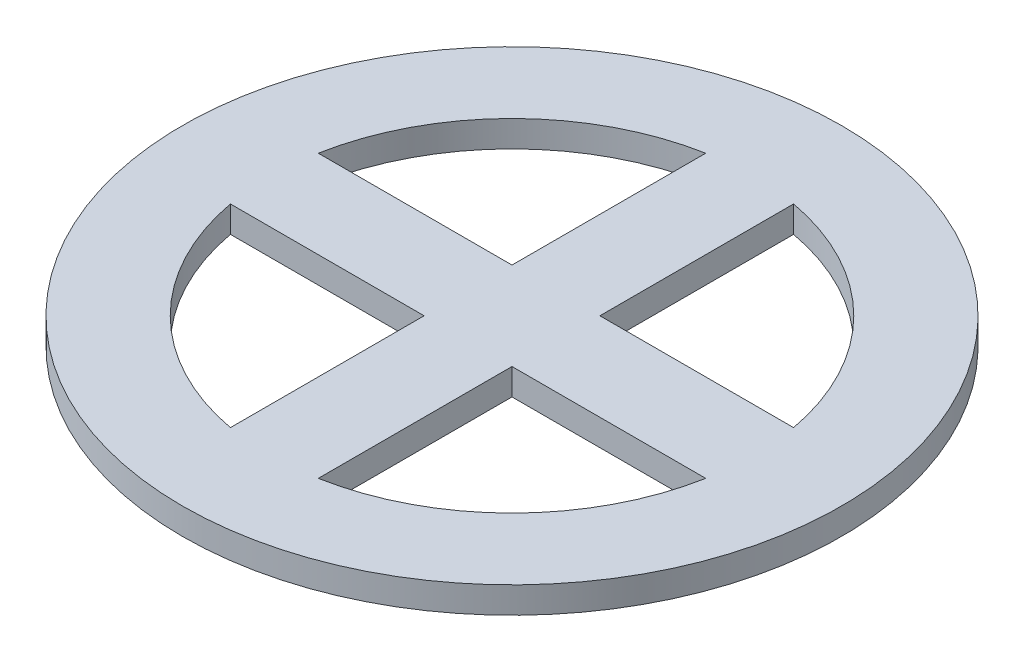
ISO-10303-21;
HEADER;
FILE_DESCRIPTION(('STEP AP214'),'2;1');
FILE_NAME('part.step','',(''),(''),'','','');
FILE_SCHEMA(('AUTOMOTIVE_DESIGN { 1 0 10303 214 1 1 1 1 }'));
ENDSEC;
DATA;
#1=APPLICATION_CONTEXT('core data for automotive mechanical design processes');
#2=APPLICATION_PROTOCOL_DEFINITION('international standard','automotive_design',2000,#1);
#3=PRODUCT_CONTEXT('',#1,'mechanical');
#4=PRODUCT('Part','Part','',(#3));
#5=PRODUCT_RELATED_PRODUCT_CATEGORY('part','',(#4));
#6=PRODUCT_DEFINITION_FORMATION('','',#4);
#7=PRODUCT_DEFINITION_CONTEXT('part definition',#1,'design');
#8=PRODUCT_DEFINITION('design','',#6,#7);
#9=PRODUCT_DEFINITION_SHAPE('','',#8);
#10=(LENGTH_UNIT() NAMED_UNIT(*) SI_UNIT(.MILLI.,.METRE.));
#11=(NAMED_UNIT(*) PLANE_ANGLE_UNIT() SI_UNIT($,.RADIAN.));
#12=(NAMED_UNIT(*) SI_UNIT($,.STERADIAN.) SOLID_ANGLE_UNIT());
#13=UNCERTAINTY_MEASURE_WITH_UNIT(LENGTH_MEASURE(1.E-05),#10,'distance_accuracy_value','');
#14=(GEOMETRIC_REPRESENTATION_CONTEXT(3) GLOBAL_UNCERTAINTY_ASSIGNED_CONTEXT((#13)) GLOBAL_UNIT_ASSIGNED_CONTEXT((#10,
#11,#12)) REPRESENTATION_CONTEXT('',''));
#15=CARTESIAN_POINT('',(0.,0.,0.));
#16=DIRECTION('',(0.,0.,1.));
#17=DIRECTION('',(1.,0.,0.));
#18=AXIS2_PLACEMENT_3D('',#15,#16,#17);
#19=CARTESIAN_POINT('',(-10.,6.,0.));
#20=DIRECTION('',(1.,0.,0.));
#21=DIRECTION('',(0.,0.,-1.));
#22=AXIS2_PLACEMENT_3D('',#19,#20,#21);
#23=PLANE('',#22);
#24=DIRECTION('',(0.,0.,1.));
#25=VECTOR('',#24,1.);
#26=CARTESIAN_POINT('',(-10.,0.,0.));
#27=LINE('',#26,#25);
#28=CARTESIAN_POINT('',(-10.,0.,-54.0832691319599));
#29=VERTEX_POINT('',#28);
#30=CARTESIAN_POINT('',(-10.,0.,-10.));
#31=VERTEX_POINT('',#30);
#32=EDGE_CURVE('E138',#29,#31,#27,.T.);
#33=ORIENTED_EDGE('',*,*,#32,.T.);
#34=DIRECTION('',(0.,-1.,0.));
#35=VECTOR('',#34,1.);
#36=CARTESIAN_POINT('',(-10.,6.,-10.));
#37=LINE('',#36,#35);
#38=CARTESIAN_POINT('',(-10.,6.,-10.));
#39=VERTEX_POINT('',#38);
#40=EDGE_CURVE('E11',#39,#31,#37,.T.);
#41=ORIENTED_EDGE('',*,*,#40,.F.);
#42=DIRECTION('',(0.,0.,1.));
#43=VECTOR('',#42,1.);
#44=CARTESIAN_POINT('',(-10.,6.,0.));
#45=LINE('',#44,#43);
#46=CARTESIAN_POINT('',(-10.,6.,-54.0832691319599));
#47=VERTEX_POINT('',#46);
#48=EDGE_CURVE('E129',#47,#39,#45,.T.);
#49=ORIENTED_EDGE('',*,*,#48,.F.);
#50=DIRECTION('',(0.,-1.,0.));
#51=VECTOR('',#50,1.);
#52=CARTESIAN_POINT('',(-10.,6.,-54.0832691319599));
#53=LINE('',#52,#51);
#54=EDGE_CURVE('E52',#47,#29,#53,.T.);
#55=ORIENTED_EDGE('',*,*,#54,.T.);
#56=EDGE_LOOP('',(#33,#41,#49,#55));
#57=FACE_BOUND('',#56,.T.);
#58=ADVANCED_FACE('F33',(#57),#23,.F.);
#59=CARTESIAN_POINT('',(0.,6.,-10.));
#60=DIRECTION('',(0.,0.,-1.));
#61=DIRECTION('',(-1.,0.,0.));
#62=AXIS2_PLACEMENT_3D('',#59,#60,#61);
#63=PLANE('',#62);
#64=DIRECTION('',(1.,0.,0.));
#65=VECTOR('',#64,1.);
#66=CARTESIAN_POINT('',(0.,0.,-10.));
#67=LINE('',#66,#65);
#68=CARTESIAN_POINT('',(-54.0832691319599,0.,-10.));
#69=VERTEX_POINT('',#68);
#70=EDGE_CURVE('E176',#69,#31,#67,.T.);
#71=ORIENTED_EDGE('',*,*,#70,.F.);
#72=DIRECTION('',(0.,-1.,0.));
#73=VECTOR('',#72,1.);
#74=CARTESIAN_POINT('',(-54.0832691319599,6.,-10.));
#75=LINE('',#74,#73);
#76=CARTESIAN_POINT('',(-54.0832691319599,6.,-10.));
#77=VERTEX_POINT('',#76);
#78=EDGE_CURVE('E43',#77,#69,#75,.T.);
#79=ORIENTED_EDGE('',*,*,#78,.F.);
#80=DIRECTION('',(1.,0.,0.));
#81=VECTOR('',#80,1.);
#82=CARTESIAN_POINT('',(0.,6.,-10.));
#83=LINE('',#82,#81);
#84=EDGE_CURVE('E134',#77,#39,#83,.T.);
#85=ORIENTED_EDGE('',*,*,#84,.T.);
#86=ORIENTED_EDGE('',*,*,#40,.T.);
#87=EDGE_LOOP('',(#71,#79,#85,#86));
#88=FACE_BOUND('',#87,.T.);
#89=ADVANCED_FACE('F141',(#88),#63,.T.);
#90=CARTESIAN_POINT('',(10.,6.,0.));
#91=DIRECTION('',(1.,0.,0.));
#92=DIRECTION('',(0.,0.,-1.));
#93=AXIS2_PLACEMENT_3D('',#90,#91,#92);
#94=PLANE('',#93);
#95=DIRECTION('',(0.,0.,1.));
#96=VECTOR('',#95,1.);
#97=CARTESIAN_POINT('',(10.,0.,0.));
#98=LINE('',#97,#96);
#99=CARTESIAN_POINT('',(10.,0.,10.));
#100=VERTEX_POINT('',#99);
#101=CARTESIAN_POINT('',(10.,0.,54.0832691319599));
#102=VERTEX_POINT('',#101);
#103=EDGE_CURVE('E168',#100,#102,#98,.T.);
#104=ORIENTED_EDGE('',*,*,#103,.F.);
#105=DIRECTION('',(0.,-1.,0.));
#106=VECTOR('',#105,1.);
#107=CARTESIAN_POINT('',(10.,6.,10.));
#108=LINE('',#107,#106);
#109=CARTESIAN_POINT('',(10.,6.,10.));
#110=VERTEX_POINT('',#109);
#111=EDGE_CURVE('E183',#110,#100,#108,.T.);
#112=ORIENTED_EDGE('',*,*,#111,.F.);
#113=DIRECTION('',(0.,0.,1.));
#114=VECTOR('',#113,1.);
#115=CARTESIAN_POINT('',(10.,6.,0.));
#116=LINE('',#115,#114);
#117=CARTESIAN_POINT('',(10.,6.,54.0832691319599));
#118=VERTEX_POINT('',#117);
#119=EDGE_CURVE('E220',#110,#118,#116,.T.);
#120=ORIENTED_EDGE('',*,*,#119,.T.);
#121=DIRECTION('',(0.,-1.,0.));
#122=VECTOR('',#121,1.);
#123=CARTESIAN_POINT('',(10.,6.,54.0832691319599));
#124=LINE('',#123,#122);
#125=EDGE_CURVE('E185',#118,#102,#124,.T.);
#126=ORIENTED_EDGE('',*,*,#125,.T.);
#127=EDGE_LOOP('',(#104,#112,#120,#126));
#128=FACE_BOUND('',#127,.T.);
#129=ADVANCED_FACE('F263',(#128),#94,.T.);
#130=CARTESIAN_POINT('',(0.,6.,10.));
#131=DIRECTION('',(0.,0.,-1.));
#132=DIRECTION('',(-1.,0.,0.));
#133=AXIS2_PLACEMENT_3D('',#130,#131,#132);
#134=PLANE('',#133);
#135=DIRECTION('',(1.,0.,0.));
#136=VECTOR('',#135,1.);
#137=CARTESIAN_POINT('',(0.,0.,10.));
#138=LINE('',#137,#136);
#139=CARTESIAN_POINT('',(54.0832691319599,0.,10.));
#140=VERTEX_POINT('',#139);
#141=EDGE_CURVE('E171',#100,#140,#138,.T.);
#142=ORIENTED_EDGE('',*,*,#141,.T.);
#143=DIRECTION('',(0.,-1.,0.));
#144=VECTOR('',#143,1.);
#145=CARTESIAN_POINT('',(54.0832691319599,6.,10.));
#146=LINE('',#145,#144);
#147=CARTESIAN_POINT('',(54.0832691319599,6.,10.));
#148=VERTEX_POINT('',#147);
#149=EDGE_CURVE('E187',#148,#140,#146,.T.);
#150=ORIENTED_EDGE('',*,*,#149,.F.);
#151=DIRECTION('',(1.,0.,0.));
#152=VECTOR('',#151,1.);
#153=CARTESIAN_POINT('',(0.,6.,10.));
#154=LINE('',#153,#152);
#155=EDGE_CURVE('E224',#110,#148,#154,.T.);
#156=ORIENTED_EDGE('',*,*,#155,.F.);
#157=ORIENTED_EDGE('',*,*,#111,.T.);
#158=EDGE_LOOP('',(#142,#150,#156,#157));
#159=FACE_BOUND('',#158,.T.);
#160=ADVANCED_FACE('F236',(#159),#134,.F.);
#161=CARTESIAN_POINT('',(0.,6.,-10.));
#162=DIRECTION('',(0.,0.,-1.));
#163=DIRECTION('',(-1.,0.,0.));
#164=AXIS2_PLACEMENT_3D('',#161,#162,#163);
#165=PLANE('',#164);
#166=DIRECTION('',(1.,0.,0.));
#167=VECTOR('',#166,1.);
#168=CARTESIAN_POINT('',(0.,0.,-10.));
#169=LINE('',#168,#167);
#170=CARTESIAN_POINT('',(10.,0.,-10.));
#171=VERTEX_POINT('',#170);
#172=CARTESIAN_POINT('',(54.0832691319599,0.,-10.));
#173=VERTEX_POINT('',#172);
#174=EDGE_CURVE('E160',#171,#173,#169,.T.);
#175=ORIENTED_EDGE('',*,*,#174,.F.);
#176=DIRECTION('',(0.,-1.,0.));
#177=VECTOR('',#176,1.);
#178=CARTESIAN_POINT('',(10.,6.,-10.));
#179=LINE('',#178,#177);
#180=CARTESIAN_POINT('',(10.,6.,-10.));
#181=VERTEX_POINT('',#180);
#182=EDGE_CURVE('E188',#181,#171,#179,.T.);
#183=ORIENTED_EDGE('',*,*,#182,.F.);
#184=DIRECTION('',(1.,0.,0.));
#185=VECTOR('',#184,1.);
#186=CARTESIAN_POINT('',(0.,6.,-10.));
#187=LINE('',#186,#185);
#188=CARTESIAN_POINT('',(54.0832691319599,6.,-10.));
#189=VERTEX_POINT('',#188);
#190=EDGE_CURVE('E213',#181,#189,#187,.T.);
#191=ORIENTED_EDGE('',*,*,#190,.T.);
#192=DIRECTION('',(0.,-1.,0.));
#193=VECTOR('',#192,1.);
#194=CARTESIAN_POINT('',(54.0832691319599,6.,-10.));
#195=LINE('',#194,#193);
#196=EDGE_CURVE('E191',#189,#173,#195,.T.);
#197=ORIENTED_EDGE('',*,*,#196,.T.);
#198=EDGE_LOOP('',(#175,#183,#191,#197));
#199=FACE_BOUND('',#198,.T.);
#200=ADVANCED_FACE('F267',(#199),#165,.T.);
#201=CARTESIAN_POINT('',(10.,6.,0.));
#202=DIRECTION('',(1.,0.,0.));
#203=DIRECTION('',(0.,0.,-1.));
#204=AXIS2_PLACEMENT_3D('',#201,#202,#203);
#205=PLANE('',#204);
#206=DIRECTION('',(0.,0.,1.));
#207=VECTOR('',#206,1.);
#208=CARTESIAN_POINT('',(10.,0.,0.));
#209=LINE('',#208,#207);
#210=CARTESIAN_POINT('',(10.,0.,-54.0832691319599));
#211=VERTEX_POINT('',#210);
#212=EDGE_CURVE('E165',#211,#171,#209,.T.);
#213=ORIENTED_EDGE('',*,*,#212,.F.);
#214=DIRECTION('',(0.,-1.,0.));
#215=VECTOR('',#214,1.);
#216=CARTESIAN_POINT('',(10.,6.,-54.0832691319599));
#217=LINE('',#216,#215);
#218=CARTESIAN_POINT('',(10.,6.,-54.0832691319599));
#219=VERTEX_POINT('',#218);
#220=EDGE_CURVE('E193',#219,#211,#217,.T.);
#221=ORIENTED_EDGE('',*,*,#220,.F.);
#222=DIRECTION('',(0.,0.,1.));
#223=VECTOR('',#222,1.);
#224=CARTESIAN_POINT('',(10.,6.,0.));
#225=LINE('',#224,#223);
#226=EDGE_CURVE('E216',#219,#181,#225,.T.);
#227=ORIENTED_EDGE('',*,*,#226,.T.);
#228=ORIENTED_EDGE('',*,*,#182,.T.);
#229=EDGE_LOOP('',(#213,#221,#227,#228));
#230=FACE_BOUND('',#229,.T.);
#231=ADVANCED_FACE('F271',(#230),#205,.T.);
#232=CARTESIAN_POINT('',(0.,6.,10.));
#233=DIRECTION('',(0.,0.,-1.));
#234=DIRECTION('',(-1.,0.,0.));
#235=AXIS2_PLACEMENT_3D('',#232,#233,#234);
#236=PLANE('',#235);
#237=DIRECTION('',(1.,0.,0.));
#238=VECTOR('',#237,1.);
#239=CARTESIAN_POINT('',(0.,0.,10.));
#240=LINE('',#239,#238);
#241=CARTESIAN_POINT('',(-54.0832691319599,0.,10.));
#242=VERTEX_POINT('',#241);
#243=CARTESIAN_POINT('',(-10.,0.,10.));
#244=VERTEX_POINT('',#243);
#245=EDGE_CURVE('E151',#242,#244,#240,.T.);
#246=ORIENTED_EDGE('',*,*,#245,.T.);
#247=DIRECTION('',(0.,-1.,0.));
#248=VECTOR('',#247,1.);
#249=CARTESIAN_POINT('',(-10.,6.,10.));
#250=LINE('',#249,#248);
#251=CARTESIAN_POINT('',(-10.,6.,10.));
#252=VERTEX_POINT('',#251);
#253=EDGE_CURVE('E37',#252,#244,#250,.T.);
#254=ORIENTED_EDGE('',*,*,#253,.F.);
#255=DIRECTION('',(1.,0.,0.));
#256=VECTOR('',#255,1.);
#257=CARTESIAN_POINT('',(0.,6.,10.));
#258=LINE('',#257,#256);
#259=CARTESIAN_POINT('',(-54.0832691319599,6.,10.));
#260=VERTEX_POINT('',#259);
#261=EDGE_CURVE('E181',#260,#252,#258,.T.);
#262=ORIENTED_EDGE('',*,*,#261,.F.);
#263=DIRECTION('',(0.,-1.,0.));
#264=VECTOR('',#263,1.);
#265=CARTESIAN_POINT('',(-54.0832691319599,6.,10.));
#266=LINE('',#265,#264);
#267=EDGE_CURVE('E150',#260,#242,#266,.T.);
#268=ORIENTED_EDGE('',*,*,#267,.T.);
#269=EDGE_LOOP('',(#246,#254,#262,#268));
#270=FACE_BOUND('',#269,.T.);
#271=ADVANCED_FACE('F35',(#270),#236,.F.);
#272=CARTESIAN_POINT('',(-10.,6.,0.));
#273=DIRECTION('',(1.,0.,0.));
#274=DIRECTION('',(0.,0.,-1.));
#275=AXIS2_PLACEMENT_3D('',#272,#273,#274);
#276=PLANE('',#275);
#277=DIRECTION('',(0.,0.,1.));
#278=VECTOR('',#277,1.);
#279=CARTESIAN_POINT('',(-10.,0.,0.));
#280=LINE('',#279,#278);
#281=CARTESIAN_POINT('',(-10.,0.,54.0832691319599));
#282=VERTEX_POINT('',#281);
#283=EDGE_CURVE('E154',#244,#282,#280,.T.);
#284=ORIENTED_EDGE('',*,*,#283,.T.);
#285=DIRECTION('',(0.,-1.,0.));
#286=VECTOR('',#285,1.);
#287=CARTESIAN_POINT('',(-10.,6.,54.0832691319599));
#288=LINE('',#287,#286);
#289=CARTESIAN_POINT('',(-10.,6.,54.0832691319599));
#290=VERTEX_POINT('',#289);
#291=EDGE_CURVE('E196',#290,#282,#288,.T.);
#292=ORIENTED_EDGE('',*,*,#291,.F.);
#293=DIRECTION('',(0.,0.,1.));
#294=VECTOR('',#293,1.);
#295=CARTESIAN_POINT('',(-10.,6.,0.));
#296=LINE('',#295,#294);
#297=EDGE_CURVE('E101',#252,#290,#296,.T.);
#298=ORIENTED_EDGE('',*,*,#297,.F.);
#299=ORIENTED_EDGE('',*,*,#253,.T.);
#300=EDGE_LOOP('',(#284,#292,#298,#299));
#301=FACE_BOUND('',#300,.T.);
#302=ADVANCED_FACE('F201',(#301),#276,.F.);
#303=CARTESIAN_POINT('',(0.,6.,0.));
#304=DIRECTION('',(0.,-1.,0.));
#305=DIRECTION('',(0.,0.,-1.));
#306=AXIS2_PLACEMENT_3D('',#303,#304,#305);
#307=CYLINDRICAL_SURFACE('',#306,55.);
#308=CARTESIAN_POINT('',(0.,0.,0.));
#309=DIRECTION('',(0.,1.,0.));
#310=DIRECTION('',(0.,0.,1.));
#311=AXIS2_PLACEMENT_3D('',#308,#309,#310);
#312=CIRCLE('',#311,55.);
#313=EDGE_CURVE('E161',#29,#69,#312,.T.);
#314=ORIENTED_EDGE('',*,*,#313,.F.);
#315=ORIENTED_EDGE('',*,*,#54,.F.);
#316=CARTESIAN_POINT('',(0.,6.,0.));
#317=DIRECTION('',(0.,1.,0.));
#318=DIRECTION('',(0.,0.,1.));
#319=AXIS2_PLACEMENT_3D('',#316,#317,#318);
#320=CIRCLE('',#319,55.);
#321=EDGE_CURVE('E135',#47,#77,#320,.T.);
#322=ORIENTED_EDGE('',*,*,#321,.T.);
#323=ORIENTED_EDGE('',*,*,#78,.T.);
#324=EDGE_LOOP('',(#314,#315,#322,#323));
#325=FACE_BOUND('',#324,.T.);
#326=ADVANCED_FACE('F246',(#325),#307,.F.);
#327=EDGE_CURVE('E174',#102,#140,#312,.T.);
#328=ORIENTED_EDGE('',*,*,#327,.F.);
#329=ORIENTED_EDGE('',*,*,#125,.F.);
#330=EDGE_CURVE('E136',#118,#148,#320,.T.);
#331=ORIENTED_EDGE('',*,*,#330,.T.);
#332=ORIENTED_EDGE('',*,*,#149,.T.);
#333=EDGE_LOOP('',(#328,#329,#331,#332));
#334=FACE_BOUND('',#333,.T.);
#335=ADVANCED_FACE('F240',(#334),#307,.F.);
#336=EDGE_CURVE('E162',#173,#211,#312,.T.);
#337=ORIENTED_EDGE('',*,*,#336,.F.);
#338=ORIENTED_EDGE('',*,*,#196,.F.);
#339=EDGE_CURVE('E214',#189,#219,#320,.T.);
#340=ORIENTED_EDGE('',*,*,#339,.T.);
#341=ORIENTED_EDGE('',*,*,#220,.T.);
#342=EDGE_LOOP('',(#337,#338,#340,#341));
#343=FACE_BOUND('',#342,.T.);
#344=ADVANCED_FACE('F253',(#343),#307,.F.);
#345=EDGE_CURVE('E157',#242,#282,#312,.T.);
#346=ORIENTED_EDGE('',*,*,#345,.F.);
#347=ORIENTED_EDGE('',*,*,#267,.F.);
#348=EDGE_CURVE('E145',#260,#290,#320,.T.);
#349=ORIENTED_EDGE('',*,*,#348,.T.);
#350=ORIENTED_EDGE('',*,*,#291,.T.);
#351=EDGE_LOOP('',(#346,#347,#349,#350));
#352=FACE_BOUND('',#351,.T.);
#353=ADVANCED_FACE('F208',(#352),#307,.F.);
#354=CARTESIAN_POINT('',(0.,6.,0.));
#355=DIRECTION('',(0.,-1.,0.));
#356=DIRECTION('',(0.,0.,-1.));
#357=AXIS2_PLACEMENT_3D('',#354,#355,#356);
#358=CYLINDRICAL_SURFACE('',#357,75.);
#359=CARTESIAN_POINT('',(0.,6.,0.));
#360=DIRECTION('',(0.,1.,0.));
#361=DIRECTION('',(0.,0.,1.));
#362=AXIS2_PLACEMENT_3D('',#359,#360,#361);
#363=CIRCLE('',#362,75.);
#364=CARTESIAN_POINT('',(0.,6.,75.));
#365=VERTEX_POINT('',#364);
#366=EDGE_CURVE('E143',#365,#365,#363,.T.);
#367=ORIENTED_EDGE('',*,*,#366,.F.);
#368=EDGE_LOOP('',(#367));
#369=FACE_BOUND('',#368,.T.);
#370=CARTESIAN_POINT('',(0.,0.,0.));
#371=DIRECTION('',(0.,1.,0.));
#372=DIRECTION('',(0.,0.,1.));
#373=AXIS2_PLACEMENT_3D('',#370,#371,#372);
#374=CIRCLE('',#373,75.);
#375=CARTESIAN_POINT('',(0.,0.,75.));
#376=VERTEX_POINT('',#375);
#377=EDGE_CURVE('E178',#376,#376,#374,.T.);
#378=ORIENTED_EDGE('',*,*,#377,.T.);
#379=EDGE_LOOP('',(#378));
#380=FACE_BOUND('',#379,.T.);
#381=ADVANCED_FACE('F257',(#369,#380),#358,.T.);
#382=CARTESIAN_POINT('',(0.,6.,0.));
#383=DIRECTION('',(0.,1.,0.));
#384=DIRECTION('',(0.,0.,1.));
#385=AXIS2_PLACEMENT_3D('',#382,#383,#384);
#386=PLANE('',#385);
#387=ORIENTED_EDGE('',*,*,#261,.T.);
#388=ORIENTED_EDGE('',*,*,#297,.T.);
#389=ORIENTED_EDGE('',*,*,#348,.F.);
#390=EDGE_LOOP('',(#387,#388,#389));
#391=FACE_BOUND('',#390,.T.);
#392=ORIENTED_EDGE('',*,*,#190,.F.);
#393=ORIENTED_EDGE('',*,*,#226,.F.);
#394=ORIENTED_EDGE('',*,*,#339,.F.);
#395=EDGE_LOOP('',(#392,#393,#394));
#396=FACE_BOUND('',#395,.T.);
#397=ORIENTED_EDGE('',*,*,#119,.F.);
#398=ORIENTED_EDGE('',*,*,#155,.T.);
#399=ORIENTED_EDGE('',*,*,#330,.F.);
#400=EDGE_LOOP('',(#397,#398,#399));
#401=FACE_BOUND('',#400,.T.);
#402=ORIENTED_EDGE('',*,*,#48,.T.);
#403=ORIENTED_EDGE('',*,*,#84,.F.);
#404=ORIENTED_EDGE('',*,*,#321,.F.);
#405=EDGE_LOOP('',(#402,#403,#404));
#406=FACE_BOUND('',#405,.T.);
#407=ORIENTED_EDGE('',*,*,#366,.T.);
#408=EDGE_LOOP('',(#407));
#409=FACE_BOUND('',#408,.T.);
#410=ADVANCED_FACE('F131',(#391,#396,#401,#406,#409),#386,.T.);
#411=CARTESIAN_POINT('',(0.,0.,0.));
#412=DIRECTION('',(0.,1.,0.));
#413=DIRECTION('',(0.,0.,1.));
#414=AXIS2_PLACEMENT_3D('',#411,#412,#413);
#415=PLANE('',#414);
#416=ORIENTED_EDGE('',*,*,#245,.F.);
#417=ORIENTED_EDGE('',*,*,#345,.T.);
#418=ORIENTED_EDGE('',*,*,#283,.F.);
#419=EDGE_LOOP('',(#416,#417,#418));
#420=FACE_BOUND('',#419,.T.);
#421=ORIENTED_EDGE('',*,*,#174,.T.);
#422=ORIENTED_EDGE('',*,*,#336,.T.);
#423=ORIENTED_EDGE('',*,*,#212,.T.);
#424=EDGE_LOOP('',(#421,#422,#423));
#425=FACE_BOUND('',#424,.T.);
#426=ORIENTED_EDGE('',*,*,#103,.T.);
#427=ORIENTED_EDGE('',*,*,#327,.T.);
#428=ORIENTED_EDGE('',*,*,#141,.F.);
#429=EDGE_LOOP('',(#426,#427,#428));
#430=FACE_BOUND('',#429,.T.);
#431=ORIENTED_EDGE('',*,*,#32,.F.);
#432=ORIENTED_EDGE('',*,*,#313,.T.);
#433=ORIENTED_EDGE('',*,*,#70,.T.);
#434=EDGE_LOOP('',(#431,#432,#433));
#435=FACE_BOUND('',#434,.T.);
#436=ORIENTED_EDGE('',*,*,#377,.F.);
#437=EDGE_LOOP('',(#436));
#438=FACE_BOUND('',#437,.T.);
#439=ADVANCED_FACE('F206',(#420,#425,#430,#435,#438),#415,.F.);
#440=CLOSED_SHELL('',(#58,#89,#129,#160,#200,#231,#271,#302,#326,#335,#344,#353,#381,#410,#439));
#441=MANIFOLD_SOLID_BREP('B2',#440);
#442=ADVANCED_BREP_SHAPE_REPRESENTATION('',(#18,#441),#14);
#443=SHAPE_DEFINITION_REPRESENTATION(#9,#442);
ENDSEC;
END-ISO-10303-21;
